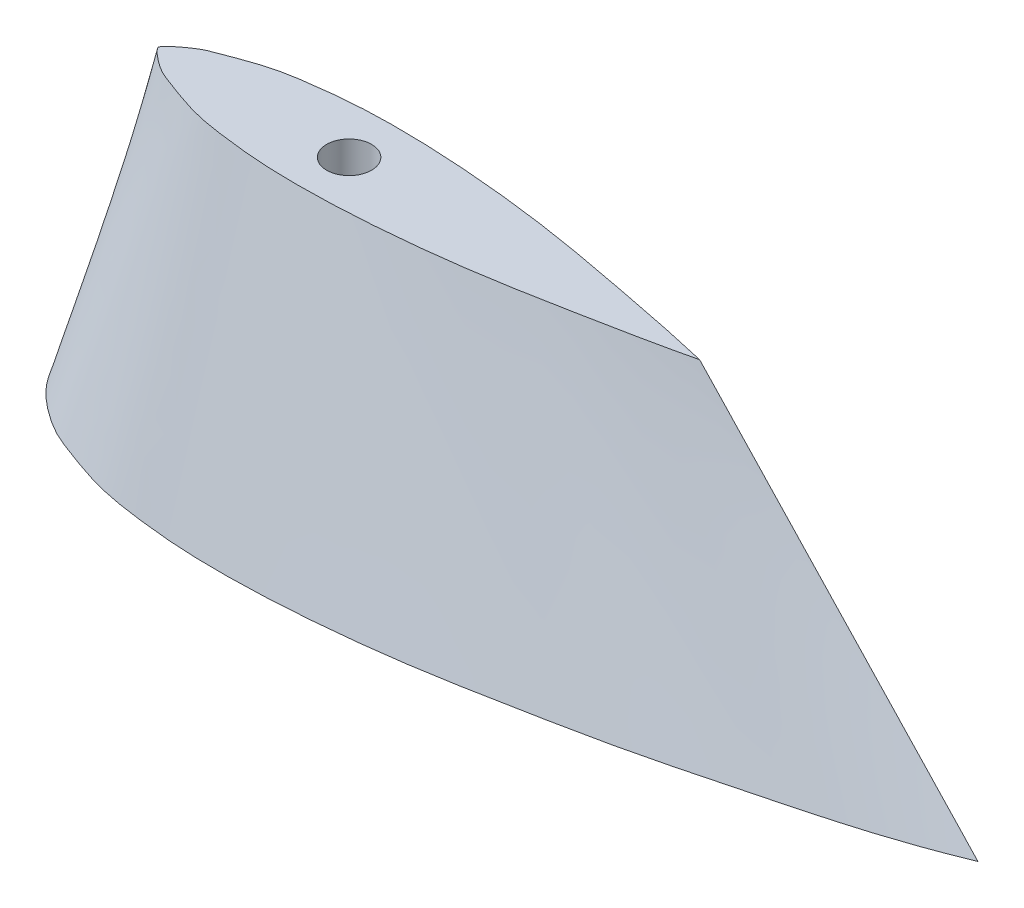
ISO-10303-21;
HEADER;
FILE_DESCRIPTION(('STEP AP214'),'2;1');
FILE_NAME('part.step','',(''),(''),'','','');
FILE_SCHEMA(('AUTOMOTIVE_DESIGN { 1 0 10303 214 1 1 1 1 }'));
ENDSEC;
DATA;
#1=APPLICATION_CONTEXT('core data for automotive mechanical design processes');
#2=APPLICATION_PROTOCOL_DEFINITION('international standard','automotive_design',2000,#1);
#3=PRODUCT_CONTEXT('',#1,'mechanical');
#4=PRODUCT('Part','Part','',(#3));
#5=PRODUCT_RELATED_PRODUCT_CATEGORY('part','',(#4));
#6=PRODUCT_DEFINITION_FORMATION('','',#4);
#7=PRODUCT_DEFINITION_CONTEXT('part definition',#1,'design');
#8=PRODUCT_DEFINITION('design','',#6,#7);
#9=PRODUCT_DEFINITION_SHAPE('','',#8);
#10=(LENGTH_UNIT() NAMED_UNIT(*) SI_UNIT(.MILLI.,.METRE.));
#11=(NAMED_UNIT(*) PLANE_ANGLE_UNIT() SI_UNIT($,.RADIAN.));
#12=(NAMED_UNIT(*) SI_UNIT($,.STERADIAN.) SOLID_ANGLE_UNIT());
#13=UNCERTAINTY_MEASURE_WITH_UNIT(LENGTH_MEASURE(1.E-05),#10,'distance_accuracy_value','');
#14=(GEOMETRIC_REPRESENTATION_CONTEXT(3) GLOBAL_UNCERTAINTY_ASSIGNED_CONTEXT((#13)) GLOBAL_UNIT_ASSIGNED_CONTEXT((#10,
#11,#12)) REPRESENTATION_CONTEXT('',''));
#15=CARTESIAN_POINT('',(0.,0.,0.));
#16=DIRECTION('',(0.,0.,1.));
#17=DIRECTION('',(1.,0.,0.));
#18=AXIS2_PLACEMENT_3D('',#15,#16,#17);
#19=CARTESIAN_POINT('',(19.0802860059302,0.,5.18409429456845));
#20=DIRECTION('',(0.,-1.,0.));
#21=DIRECTION('',(0.,0.,-1.));
#22=AXIS2_PLACEMENT_3D('',#19,#20,#21);
#23=PLANE('',#22);
#24=CARTESIAN_POINT('',(0.,0.,0.));
#25=CARTESIAN_POINT('',(-0.0267862569875493,0.,0.969360716181965));
#26=CARTESIAN_POINT('',(0.617375659509529,0.,2.24930193441446));
#27=CARTESIAN_POINT('',(1.97482933682201,0.,3.39277564434882));
#28=CARTESIAN_POINT('',(2.99392084160678,0.,4.05195265848345));
#29=CARTESIAN_POINT('',(4.35572051871566,0.,4.56510135506526));
#30=CARTESIAN_POINT('',(5.9908082561554,0.,5.164346360671));
#31=CARTESIAN_POINT('',(8.01785030280747,0.,5.47891926631261));
#32=CARTESIAN_POINT('',(10.008939200588,0.,5.68541086366569));
#33=CARTESIAN_POINT('',(12.6758373668734,0.,5.74502086480361));
#34=CARTESIAN_POINT('',(16.0113581950967,0.,5.57131916796599));
#35=CARTESIAN_POINT('',(20.0191877740499,0.,5.09406590814649));
#36=CARTESIAN_POINT('',(23.9996212201312,0.,4.33539965898221));
#37=CARTESIAN_POINT('',(28.002273255999,0.,3.54824991840482));
#38=CARTESIAN_POINT('',(31.9895849783426,0.,2.48087377414352));
#39=CARTESIAN_POINT('',(36.0342167931576,0.,1.46216580021811));
#40=CARTESIAN_POINT('',(38.6894828941162,0.,0.534654706419167));
#41=CARTESIAN_POINT('',(39.98934,0.,0.));
#42=B_SPLINE_CURVE_WITH_KNOTS('',3,(#24,#25,#26,#27,#28,#29,#30,#31,#32,#33,#34,#35,#36,#37,#38,
#39,#40,#41),.UNSPECIFIED.,.F.,.F.,(4,1,1,1,1,1,1,1,1,1,1,1,1,1,1,4),(0.,0.0635158889828134,
0.0951250781733294,0.122624180129919,0.14741856907962,0.196010901472146,0.243367076159032,
0.289416436062413,0.335172982570437,0.42859362926416,0.521350125542034,0.615481240432389,
0.710185536025907,0.804793670830186,0.902313956548564,1.),.UNSPECIFIED.);
#43=CARTESIAN_POINT('',(0.,0.,0.));
#44=VERTEX_POINT('',#43);
#45=CARTESIAN_POINT('',(39.98934,0.,0.));
#46=VERTEX_POINT('',#45);
#47=EDGE_CURVE('E73',#44,#46,#42,.T.);
#48=ORIENTED_EDGE('',*,*,#47,.F.);
#49=CARTESIAN_POINT('',(39.98934,0.,0.));
#50=CARTESIAN_POINT('',(38.6894828941162,0.,-0.534654706419167));
#51=CARTESIAN_POINT('',(36.0342167931576,0.,-1.46216580021811));
#52=CARTESIAN_POINT('',(31.9895849783426,0.,-2.48087377414352));
#53=CARTESIAN_POINT('',(28.002273255999,0.,-3.54824991840482));
#54=CARTESIAN_POINT('',(23.9996212201312,0.,-4.33539965898221));
#55=CARTESIAN_POINT('',(20.0191877740499,0.,-5.09406590814649));
#56=CARTESIAN_POINT('',(16.0113581950967,0.,-5.57131916796599));
#57=CARTESIAN_POINT('',(12.6758373668734,0.,-5.74502086480361));
#58=CARTESIAN_POINT('',(10.008939200588,0.,-5.68541086366568));
#59=CARTESIAN_POINT('',(8.01785030280747,0.,-5.4789192663126));
#60=CARTESIAN_POINT('',(5.9908082561554,0.,-5.164346360671));
#61=CARTESIAN_POINT('',(4.35572051871565,0.,-4.56510135506527));
#62=CARTESIAN_POINT('',(2.99392084160678,0.,-4.05195265848345));
#63=CARTESIAN_POINT('',(1.97482933682201,0.,-3.39277564434882));
#64=CARTESIAN_POINT('',(0.617375659509529,0.,-2.24930193441446));
#65=CARTESIAN_POINT('',(-0.0267862569875492,0.,-0.969360716181965));
#66=CARTESIAN_POINT('',(0.,0.,0.));
#67=B_SPLINE_CURVE_WITH_KNOTS('',3,(#49,#50,#51,#52,#53,#54,#55,#56,#57,#58,#59,#60,#61,#62,#63,
#64,#65,#66),.UNSPECIFIED.,.F.,.F.,(4,1,1,1,1,1,1,1,1,1,1,1,1,1,1,4),(0.,0.0976860434514363,
0.195206329169814,0.289814463974093,0.384518759567611,0.478649874457966,0.57140637073584,
0.664827017429563,0.710583563937587,0.756632923840968,0.803989098527854,0.85258143092038,
0.877375819870081,0.904874921826671,0.936484111017187,1.),.UNSPECIFIED.);
#68=EDGE_CURVE('E12',#46,#44,#67,.T.);
#69=ORIENTED_EDGE('',*,*,#68,.F.);
#70=EDGE_LOOP('',(#48,#69));
#71=FACE_BOUND('',#70,.T.);
#72=CARTESIAN_POINT('',(11.9968,0.,0.));
#73=DIRECTION('',(0.,1.,0.));
#74=DIRECTION('',(0.,0.,1.));
#75=AXIS2_PLACEMENT_3D('',#72,#73,#74);
#76=CIRCLE('',#75,2.);
#77=CARTESIAN_POINT('',(11.9968,0.,2.));
#78=VERTEX_POINT('',#77);
#79=EDGE_CURVE('E349',#78,#78,#76,.T.);
#80=ORIENTED_EDGE('',*,*,#79,.T.);
#81=EDGE_LOOP('',(#80));
#82=FACE_BOUND('',#81,.T.);
#83=DIRECTION('',(0.707106781186546,0.,0.707106781186549));
#84=VECTOR('',#83,1.);
#85=CARTESIAN_POINT('',(15.3578199523359,0.,3.3610199523359));
#86=LINE('',#85,#84);
#87=CARTESIAN_POINT('',(15.3578199523359,0.,3.3610199523359));
#88=VERTEX_POINT('',#87);
#89=CARTESIAN_POINT('',(16.772033514709,0.,4.77523351470901));
#90=VERTEX_POINT('',#89);
#91=EDGE_CURVE('E283',#88,#90,#86,.T.);
#92=ORIENTED_EDGE('',*,*,#91,.T.);
#93=CARTESIAN_POINT('',(11.9968,0.,0.));
#94=DIRECTION('',(0.,1.,0.));
#95=DIRECTION('',(0.,0.,1.));
#96=AXIS2_PLACEMENT_3D('',#93,#94,#95);
#97=CIRCLE('',#96,6.75320000000001);
#98=CARTESIAN_POINT('',(18.675550649635,0.,1.));
#99=VERTEX_POINT('',#98);
#100=EDGE_CURVE('E295',#90,#99,#97,.T.);
#101=ORIENTED_EDGE('',*,*,#100,.T.);
#102=DIRECTION('',(1.,0.,0.));
#103=VECTOR('',#102,1.);
#104=CARTESIAN_POINT('',(0.,0.,1.));
#105=LINE('',#104,#103);
#106=CARTESIAN_POINT('',(18.75,0.,1.));
#107=VERTEX_POINT('',#106);
#108=EDGE_CURVE('E320',#99,#107,#105,.T.);
#109=ORIENTED_EDGE('',*,*,#108,.T.);
#110=DIRECTION('',(0.,0.,-1.));
#111=VECTOR('',#110,1.);
#112=CARTESIAN_POINT('',(18.75,0.,0.));
#113=LINE('',#112,#111);
#114=CARTESIAN_POINT('',(18.75,0.,-0.999999999999998));
#115=VERTEX_POINT('',#114);
#116=EDGE_CURVE('E331',#107,#115,#113,.T.);
#117=ORIENTED_EDGE('',*,*,#116,.T.);
#118=DIRECTION('',(1.,0.,0.));
#119=VECTOR('',#118,1.);
#120=CARTESIAN_POINT('',(0.,0.,-0.999999999999998));
#121=LINE('',#120,#119);
#122=CARTESIAN_POINT('',(18.675550649635,0.,-0.999999999999998));
#123=VERTEX_POINT('',#122);
#124=EDGE_CURVE('E314',#123,#115,#121,.T.);
#125=ORIENTED_EDGE('',*,*,#124,.F.);
#126=CARTESIAN_POINT('',(16.772033514709,0.,-4.775233514709));
#127=VERTEX_POINT('',#126);
#128=EDGE_CURVE('E81',#123,#127,#97,.T.);
#129=ORIENTED_EDGE('',*,*,#128,.T.);
#130=DIRECTION('',(0.707106781186546,0.,-0.707106781186549));
#131=VECTOR('',#130,1.);
#132=CARTESIAN_POINT('',(15.3578199523359,0.,-3.3610199523359));
#133=LINE('',#132,#131);
#134=CARTESIAN_POINT('',(15.3578199523359,0.,-3.3610199523359));
#135=VERTEX_POINT('',#134);
#136=EDGE_CURVE('E253',#135,#127,#133,.T.);
#137=ORIENTED_EDGE('',*,*,#136,.F.);
#138=CARTESIAN_POINT('',(11.9968,0.,0.));
#139=DIRECTION('',(0.,1.,0.));
#140=DIRECTION('',(0.,0.,1.));
#141=AXIS2_PLACEMENT_3D('',#138,#139,#140);
#142=CIRCLE('',#141,4.7532);
#143=EDGE_CURVE('E266',#88,#135,#142,.T.);
#144=ORIENTED_EDGE('',*,*,#143,.F.);
#145=EDGE_LOOP('',(#92,#101,#109,#117,#125,#129,#137,#144));
#146=FACE_BOUND('',#145,.T.);
#147=ADVANCED_FACE('F61',(#71,#82,#146),#23,.T.);
#148=CARTESIAN_POINT('',(0.,1.5,1.));
#149=DIRECTION('',(0.,0.,-1.));
#150=DIRECTION('',(-1.,0.,0.));
#151=AXIS2_PLACEMENT_3D('',#148,#149,#150);
#152=PLANE('',#151);
#153=ORIENTED_EDGE('',*,*,#108,.F.);
#154=DIRECTION('',(0.,1.,0.));
#155=VECTOR('',#154,1.);
#156=CARTESIAN_POINT('',(18.675550649635,4.,1.));
#157=LINE('',#156,#155);
#158=CARTESIAN_POINT('',(18.675550649635,1.5,1.));
#159=VERTEX_POINT('',#158);
#160=EDGE_CURVE('E310',#99,#159,#157,.T.);
#161=ORIENTED_EDGE('',*,*,#160,.T.);
#162=DIRECTION('',(1.,0.,0.));
#163=VECTOR('',#162,1.);
#164=CARTESIAN_POINT('',(0.,1.5,1.));
#165=LINE('',#164,#163);
#166=CARTESIAN_POINT('',(18.75,1.5,1.));
#167=VERTEX_POINT('',#166);
#168=EDGE_CURVE('E323',#159,#167,#165,.T.);
#169=ORIENTED_EDGE('',*,*,#168,.T.);
#170=DIRECTION('',(0.,-1.,0.));
#171=VECTOR('',#170,1.);
#172=CARTESIAN_POINT('',(18.75,1.5,1.));
#173=LINE('',#172,#171);
#174=EDGE_CURVE('E338',#167,#107,#173,.T.);
#175=ORIENTED_EDGE('',*,*,#174,.T.);
#176=EDGE_LOOP('',(#153,#161,#169,#175));
#177=FACE_BOUND('',#176,.T.);
#178=ADVANCED_FACE('F194',(#177),#152,.T.);
#179=CARTESIAN_POINT('',(0.,1.5,-0.999999999999998));
#180=DIRECTION('',(0.,0.,-1.));
#181=DIRECTION('',(-1.,0.,0.));
#182=AXIS2_PLACEMENT_3D('',#179,#180,#181);
#183=PLANE('',#182);
#184=DIRECTION('',(0.,1.,0.));
#185=VECTOR('',#184,1.);
#186=CARTESIAN_POINT('',(18.675550649635,4.,-0.999999999999998));
#187=LINE('',#186,#185);
#188=CARTESIAN_POINT('',(18.675550649635,1.5,-0.999999999999998));
#189=VERTEX_POINT('',#188);
#190=EDGE_CURVE('E307',#123,#189,#187,.T.);
#191=ORIENTED_EDGE('',*,*,#190,.F.);
#192=ORIENTED_EDGE('',*,*,#124,.T.);
#193=DIRECTION('',(0.,-1.,0.));
#194=VECTOR('',#193,1.);
#195=CARTESIAN_POINT('',(18.75,1.5,-0.999999999999998));
#196=LINE('',#195,#194);
#197=CARTESIAN_POINT('',(18.75,1.5,-0.999999999999998));
#198=VERTEX_POINT('',#197);
#199=EDGE_CURVE('E327',#198,#115,#196,.T.);
#200=ORIENTED_EDGE('',*,*,#199,.F.);
#201=DIRECTION('',(1.,0.,0.));
#202=VECTOR('',#201,1.);
#203=CARTESIAN_POINT('',(0.,1.5,-0.999999999999998));
#204=LINE('',#203,#202);
#205=EDGE_CURVE('E315',#189,#198,#204,.T.);
#206=ORIENTED_EDGE('',*,*,#205,.F.);
#207=EDGE_LOOP('',(#191,#192,#200,#206));
#208=FACE_BOUND('',#207,.T.);
#209=ADVANCED_FACE('F212',(#208),#183,.F.);
#210=CARTESIAN_POINT('',(15.4096175103177,13.15,2.06445008176209));
#211=DIRECTION('',(0.,-1.,0.));
#212=DIRECTION('',(0.,0.,-1.));
#213=AXIS2_PLACEMENT_3D('',#210,#211,#212);
#214=PLANE('',#213);
#215=CARTESIAN_POINT('',(11.9968,13.15,0.));
#216=DIRECTION('',(0.,1.,0.));
#217=DIRECTION('',(0.,0.,1.));
#218=AXIS2_PLACEMENT_3D('',#215,#216,#217);
#219=CIRCLE('',#218,1.);
#220=CARTESIAN_POINT('',(11.9968,13.15,1.));
#221=VERTEX_POINT('',#220);
#222=EDGE_CURVE('E342',#221,#221,#219,.T.);
#223=ORIENTED_EDGE('',*,*,#222,.F.);
#224=EDGE_LOOP('',(#223));
#225=FACE_BOUND('',#224,.T.);
#226=CARTESIAN_POINT('',(3.49502453361236,13.15,0.));
#227=CARTESIAN_POINT('',(3.52783648685748,13.15,0.0578802805129642));
#228=CARTESIAN_POINT('',(3.57019641452592,13.15,0.109749182285396));
#229=CARTESIAN_POINT('',(3.65886996238812,13.15,0.208341359987878));
#230=CARTESIAN_POINT('',(3.70652893983133,13.15,0.254882194309004));
#231=CARTESIAN_POINT('',(3.85318123666836,13.15,0.388672417564009));
#232=CARTESIAN_POINT('',(3.95646294657575,13.15,0.470726547777688));
#233=CARTESIAN_POINT('',(4.16779494911165,13.15,0.62866005238863));
#234=CARTESIAN_POINT('',(4.2755874455875,13.15,0.704873242593614));
#235=CARTESIAN_POINT('',(4.49978996324191,13.15,0.846140938364016));
#236=CARTESIAN_POINT('',(4.61539075255237,13.15,0.907467588020139));
#237=CARTESIAN_POINT('',(4.85348743878743,13.15,1.01062304020525));
#238=CARTESIAN_POINT('',(4.97441630687829,13.15,1.05698878100666));
#239=CARTESIAN_POINT('',(5.21668869592504,13.15,1.14857102786693));
#240=CARTESIAN_POINT('',(5.33806631315454,13.15,1.19369303410308));
#241=CARTESIAN_POINT('',(5.70232186173396,13.15,1.32871899118004));
#242=CARTESIAN_POINT('',(5.94564329842536,13.15,1.41739374094715));
#243=CARTESIAN_POINT('',(6.4365621974042,13.15,1.58289198467385));
#244=CARTESIAN_POINT('',(6.68409437060288,13.15,1.65989643117341));
#245=CARTESIAN_POINT('',(7.18910829636706,13.15,1.7863294812304));
#246=CARTESIAN_POINT('',(7.44564437280883,13.15,1.83625827459987));
#247=CARTESIAN_POINT('',(7.95666540004131,13.15,1.92186763256478));
#248=CARTESIAN_POINT('',(8.21245069534998,13.15,1.95770180616351));
#249=CARTESIAN_POINT('',(8.72423300626651,13.15,2.02399935346357));
#250=CARTESIAN_POINT('',(8.98023200814217,13.15,2.05441234065524));
#251=CARTESIAN_POINT('',(9.74864997427261,13.15,2.13497261607166));
#252=CARTESIAN_POINT('',(10.2615367544399,13.15,2.17325261682288));
#253=CARTESIAN_POINT('',(11.288759592588,13.15,2.21304816464643));
#254=CARTESIAN_POINT('',(11.8029975192729,13.15,2.21705305051363));
#255=CARTESIAN_POINT('',(13.346857368183,13.15,2.19999488650282));
#256=CARTESIAN_POINT('',(14.3787372530508,13.15,2.1469215826625));
#257=CARTESIAN_POINT('',(16.4404977675845,13.15,1.98197858086167));
#258=CARTESIAN_POINT('',(17.4666951934531,13.15,1.87149655962416));
#259=CARTESIAN_POINT('',(19.5095691820538,13.15,1.59358314019471));
#260=CARTESIAN_POINT('',(20.5256554222723,13.15,1.42262070717237));
#261=CARTESIAN_POINT('',(22.0459077167077,13.15,1.14298625195176));
#262=CARTESIAN_POINT('',(22.5520738663946,13.15,1.04627787099308));
#263=CARTESIAN_POINT('',(23.5640788122461,13.15,0.850903032495258));
#264=CARTESIAN_POINT('',(24.0700108987621,13.15,0.752794594466486));
#265=CARTESIAN_POINT('',(25.5866270682723,13.15,0.451410530407656));
#266=CARTESIAN_POINT('',(26.5959582445756,13.15,0.240042445529623));
#267=CARTESIAN_POINT('',(27.600495607884,13.15,0.));
#268=B_SPLINE_CURVE_WITH_KNOTS('',3,(#226,#227,#228,#229,#230,#231,#232,#233,#234,#235,#236,
#237,#238,#239,#240,#241,#242,#243,#244,#245,#246,#247,#248,#249,#250,#251,#252,#253,#254,#255,
#256,#257,#258,#259,#260,#261,#262,#263,#264,#265,#266,#267),.UNSPECIFIED.,.F.,.F.,(4,2,2,2,2,2,
2,2,2,2,2,2,2,2,2,2,2,2,2,2,4),(0.,0.00781250000000006,0.0156250000000001,0.0312500000000002,
0.0468750000000003,0.0625000000000004,0.0781250000000005,0.0937500000000006,0.125000000000001,
0.156250000000001,0.187500000000001,0.218750000000001,0.250000000000001,0.312500000000001,
0.375000000000001,0.500000000000001,0.625,0.75,0.8125,0.875,1.),.UNSPECIFIED.);
#269=CARTESIAN_POINT('',(3.49502453361236,13.15,0.));
#270=VERTEX_POINT('',#269);
#271=CARTESIAN_POINT('',(27.6004956078839,13.15,0.));
#272=VERTEX_POINT('',#271);
#273=EDGE_CURVE('E105',#270,#272,#268,.T.);
#274=ORIENTED_EDGE('',*,*,#273,.T.);
#275=CARTESIAN_POINT('',(27.6004956078839,13.15,0.));
#276=CARTESIAN_POINT('',(26.5970238757128,13.15,-0.239787804225526));
#277=CARTESIAN_POINT('',(25.5903034316414,13.15,-0.450633428897801));
#278=CARTESIAN_POINT('',(24.0784535103549,13.15,-0.751139895423985));
#279=CARTESIAN_POINT('',(23.5742360869212,13.15,-0.84892605743988));
#280=CARTESIAN_POINT('',(22.5657073018342,13.15,-1.04366150307037));
#281=CARTESIAN_POINT('',(22.0613346726119,13.15,-1.14006496513042));
#282=CARTESIAN_POINT('',(20.5470464564753,13.15,-1.41884910923326));
#283=CARTESIAN_POINT('',(19.5358008319255,13.15,-1.58938072948291));
#284=CARTESIAN_POINT('',(17.5061590894782,13.15,-1.86674153384));
#285=CARTESIAN_POINT('',(16.4881540513167,13.15,-1.97705477571856));
#286=CARTESIAN_POINT('',(14.4459605242078,13.15,-2.14259402847444));
#287=CARTESIAN_POINT('',(13.4216881908912,13.15,-2.19707308521732));
#288=CARTESIAN_POINT('',(11.8783612945319,13.15,-2.21715694354417));
#289=CARTESIAN_POINT('',(11.3628515046538,13.15,-2.21434148028481));
#290=CARTESIAN_POINT('',(10.328296524146,13.15,-2.17721431572193));
#291=CARTESIAN_POINT('',(9.80895522905007,13.15,-2.14026467393841));
#292=CARTESIAN_POINT('',(9.02712939573157,13.15,-2.0597717744037));
#293=CARTESIAN_POINT('',(8.76649027299236,13.15,-2.02917017133057));
#294=CARTESIAN_POINT('',(8.246673773856,13.15,-1.96239676326558));
#295=CARTESIAN_POINT('',(7.98718809029197,13.15,-1.92643553719816));
#296=CARTESIAN_POINT('',(7.47045048117546,13.15,-1.84090371004215));
#297=CARTESIAN_POINT('',(7.21317263343112,13.15,-1.79149104227879));
#298=CARTESIAN_POINT('',(6.7030849748272,13.15,-1.66544378331271));
#299=CARTESIAN_POINT('',(6.45125789812067,13.15,-1.58763006959447));
#300=CARTESIAN_POINT('',(5.95313958794608,13.15,-1.42012760680646));
#301=CARTESIAN_POINT('',(5.70620412461664,13.15,-1.33015687682568));
#302=CARTESIAN_POINT('',(5.33651225541853,13.15,-1.19311757473801));
#303=CARTESIAN_POINT('',(5.21327113848951,13.15,-1.14731275914894));
#304=CARTESIAN_POINT('',(4.96752208583141,13.15,-1.05434762506602));
#305=CARTESIAN_POINT('',(4.84496633941889,13.15,-1.00728373387173));
#306=CARTESIAN_POINT('',(4.48580634152626,13.15,-0.85057833244267));
#307=CARTESIAN_POINT('',(4.26912100960824,13.15,-0.704612861884415));
#308=CARTESIAN_POINT('',(3.95354488041104,13.15,-0.468428314395131));
#309=CARTESIAN_POINT('',(3.84988299049597,13.15,-0.385871663651552));
#310=CARTESIAN_POINT('',(3.70460514640842,13.15,-0.253019134715244));
#311=CARTESIAN_POINT('',(3.65777763929067,13.15,-0.207183213558207));
#312=CARTESIAN_POINT('',(3.57015940668381,13.15,-0.109650945184433));
#313=CARTESIAN_POINT('',(3.52840755560896,13.15,-0.0588876457033497));
#314=CARTESIAN_POINT('',(3.49502453361236,13.15,0.));
#315=B_SPLINE_CURVE_WITH_KNOTS('',3,(#275,#276,#277,#278,#279,#280,#281,#282,#283,#284,#285,
#286,#287,#288,#289,#290,#291,#292,#293,#294,#295,#296,#297,#298,#299,#300,#301,#302,#303,#304,
#305,#306,#307,#308,#309,#310,#311,#312,#313,#314),.UNSPECIFIED.,.F.,.F.,(4,2,2,2,2,2,2,2,2,2,2,
2,2,2,2,2,2,2,2,4),(0.,0.125,0.1875,0.25,0.375,0.5,0.625,0.6875,0.75,0.781249999999999,
0.812499999999999,0.84375,0.875,0.90625,0.921875,0.9375,0.96875,0.984375,0.9921875,1.),.UNSPECIFIED.);
#316=EDGE_CURVE('E102',#272,#270,#315,.T.);
#317=ORIENTED_EDGE('',*,*,#316,.T.);
#318=EDGE_LOOP('',(#274,#317));
#319=FACE_BOUND('',#318,.T.);
#320=ADVANCED_FACE('F63',(#225,#319),#214,.F.);
#321=CARTESIAN_POINT('',(39.98934,0.,0.));
#322=CARTESIAN_POINT('',(27.6004956078839,13.15,0.));
#323=CARTESIAN_POINT('',(38.6894828941162,0.,-0.534654706419167));
#324=CARTESIAN_POINT('',(26.8162941420347,13.15,-0.187391374901594));
#325=CARTESIAN_POINT('',(36.989188318467,0.,-1.12858466359802));
#326=CARTESIAN_POINT('',(25.8102835793687,13.15,-0.404561203051774));
#327=CARTESIAN_POINT('',(35.2605920883906,0.,-1.62354844781566));
#328=CARTESIAN_POINT('',(24.8026413670929,13.15,-0.607194963545877));
#329=CARTESIAN_POINT('',(34.0155724838337,0.,-1.96873712394325));
#330=CARTESIAN_POINT('',(24.0784535103549,13.15,-0.751139895423985));
#331=CARTESIAN_POINT('',(33.1444027192992,0.,-2.19231051911635));
#332=CARTESIAN_POINT('',(23.5742360869212,13.15,-0.84892605743988));
#333=CARTESIAN_POINT('',(32.1663403636148,0.,-2.44559201466678));
#334=CARTESIAN_POINT('',(23.0077952560168,13.15,-0.958299343815595));
#335=CARTESIAN_POINT('',(31.2956943434231,0.,-2.67130662738813));
#336=CARTESIAN_POINT('',(22.5035175177537,13.15,-1.05554817205828));
#337=CARTESIAN_POINT('',(30.4261616774186,0.,-2.90121388434487));
#338=CARTESIAN_POINT('',(21.9990967875371,13.15,-1.15152311116659));
#339=CARTESIAN_POINT('',(29.107051240625,0.,-3.2365994141171));
#340=CARTESIAN_POINT('',(21.2350222078849,13.15,-1.292191099895));
#341=CARTESIAN_POINT('',(27.3614326474527,0.,-3.66759668925395));
#342=CARTESIAN_POINT('',(20.2249488365745,13.15,-1.47316610964024));
#343=CARTESIAN_POINT('',(25.5976282304248,0.,-4.02066769455246));
#344=CARTESIAN_POINT('',(19.2125644397856,13.15,-1.63355261649451));
#345=CARTESIAN_POINT('',(24.2598294094227,0.,-4.28093710864366));
#346=CARTESIAN_POINT('',(18.4437012736829,13.15,-1.73862165490207));
#347=CARTESIAN_POINT('',(22.7954837837284,0.,-4.56490693368703));
#348=CARTESIAN_POINT('',(17.6020117668273,13.15,-1.85182410142012));
#349=CARTESIAN_POINT('',(21.0285502575417,0.,-4.9016825258413));
#350=CARTESIAN_POINT('',(16.5843139501096,13.15,-1.9648743228962));
#351=CARTESIAN_POINT('',(19.3845754739158,0.,-5.14205385611547));
#352=CARTESIAN_POINT('',(15.6414616405019,13.15,-2.04568726678261));
#353=CARTESIAN_POINT('',(18.0625773971814,0.,-5.3247002656275));
#354=CARTESIAN_POINT('',(14.883754775318,13.15,-2.10710663111098));
#355=CARTESIAN_POINT('',(16.2741395980495,0.,-5.52385497568521));
#356=CARTESIAN_POINT('',(13.8608439644697,13.15,-2.1737152422594));
#357=CARTESIAN_POINT('',(14.4787007989329,0.,-5.64297223349277));
#358=CARTESIAN_POINT('',(12.8339368707418,13.15,-2.20472170086261));
#359=CARTESIAN_POINT('',(13.135551788291,0.,-5.69896502748789));
#360=CARTESIAN_POINT('',(12.064984354914,13.15,-2.21472835170528));
#361=CARTESIAN_POINT('',(12.236315672847,0.,-5.72000310773631));
#362=CARTESIAN_POINT('',(11.5498618163465,13.15,-2.21536283947532));
#363=CARTESIAN_POINT('',(11.3366114512848,0.,-5.71098871604679));
#364=CARTESIAN_POINT('',(11.0332255907296,13.15,-2.20251216644356));
#365=CARTESIAN_POINT('',(10.6783768412891,0.,-5.69385612673943));
#366=CARTESIAN_POINT('',(10.6545242860839,13.15,-2.1889216797873));
#367=CARTESIAN_POINT('',(9.77989411462971,0.,-5.65580632265626));
#368=CARTESIAN_POINT('',(10.1364845562936,13.15,-2.16356744502464));
#369=CARTESIAN_POINT('',(8.88525512527583,0.,-5.56831462826781));
#370=CARTESIAN_POINT('',(9.61645041186111,13.15,-2.12044533534715));
#371=CARTESIAN_POINT('',(8.22689277206115,0.,-5.48837488222701));
#372=CARTESIAN_POINT('',(9.23242290060516,13.15,-2.08090777267685));
#373=CARTESIAN_POINT('',(7.78020633472554,0.,-5.43235880336383));
#374=CARTESIAN_POINT('',(8.97180781329617,13.15,-2.05327647512064));
#375=CARTESIAN_POINT('',(7.33386009145752,0.,-5.36869467976266));
#376=CARTESIAN_POINT('',(8.71132382099155,13.15,-2.02208372444582));
#377=CARTESIAN_POINT('',(6.66229427758368,0.,-5.25048047624944));
#378=CARTESIAN_POINT('',(8.31745948597993,13.15,-1.97148959361759));
#379=CARTESIAN_POINT('',(6.22207463450586,0.,-5.1592215035746));
#380=CARTESIAN_POINT('',(8.05785871705184,13.15,-1.93622953565823));
#381=CARTESIAN_POINT('',(5.78931812589357,0.,-5.03999700866379));
#382=CARTESIAN_POINT('',(7.799185731784,13.15,-1.89531687087867));
#383=CARTESIAN_POINT('',(5.24086917546428,0.,-4.88020878431981));
#384=CARTESIAN_POINT('',(7.47045048117546,13.15,-1.84090371004215));
#385=CARTESIAN_POINT('',(4.81607412659508,0.,-4.73126844598601));
#386=CARTESIAN_POINT('',(7.21317263343112,13.15,-1.79149104227879));
#387=CARTESIAN_POINT('',(4.27357636186127,0.,-4.53199370376904));
#388=CARTESIAN_POINT('',(6.88605194140437,13.15,-1.71065657023155));
#389=CARTESIAN_POINT('',(3.85112813726852,0.,-4.37481036344817));
#390=CARTESIAN_POINT('',(6.63191718500911,13.15,-1.64345317731716));
#391=CARTESIAN_POINT('',(3.4292583896778,0.,-4.21598430958224));
#392=CARTESIAN_POINT('',(6.38087233897693,13.15,-1.56396148672877));
#393=CARTESIAN_POINT('',(3.10756690228043,0.,-4.06325626479817));
#394=CARTESIAN_POINT('',(6.18326371296995,13.15,-1.4975115473304));
#395=CARTESIAN_POINT('',(2.72162234920927,0.,-3.87582234405221));
#396=CARTESIAN_POINT('',(5.94531813554933,13.15,-1.41699354092471));
#397=CARTESIAN_POINT('',(2.34205629139348,0.,-3.6303083548931));
#398=CARTESIAN_POINT('',(5.69833079547927,13.15,-1.32717473850771));
#399=CARTESIAN_POINT('',(2.00652526169337,0.,-3.38274567133049));
#400=CARTESIAN_POINT('',(5.47058778984865,13.15,-1.2428173901686));
#401=CARTESIAN_POINT('',(1.80942967727917,0.,-3.23638998264542));
#402=CARTESIAN_POINT('',(5.33651225541853,13.15,-1.19311757473801));
#403=CARTESIAN_POINT('',(1.63300767383244,0.,-3.09560942090144));
#404=CARTESIAN_POINT('',(5.21327113848951,13.15,-1.14731275914894));
#405=CARTESIAN_POINT('',(1.30708933738781,0.,-2.80674496728495));
#406=CARTESIAN_POINT('',(4.97551100599563,13.15,-1.05736977724204));
#407=CARTESIAN_POINT('',(1.14612259353375,0.,-2.64950796042556));
#408=CARTESIAN_POINT('',(4.85293453350279,13.15,-1.01034368193909));
#409=CARTESIAN_POINT('',(0.996187523446304,0.,-2.4816703862658));
#410=CARTESIAN_POINT('',(4.73303016273311,13.15,-0.958444766267035));
#411=CARTESIAN_POINT('',(0.68808588029631,0.,-2.13366757121641));
#412=CARTESIAN_POINT('',(4.48580634152626,13.15,-0.85057833244267));
#413=CARTESIAN_POINT('',(0.434874680722648,0.,-1.75445331471169));
#414=CARTESIAN_POINT('',(4.26912100960824,13.15,-0.704612861884415));
#415=CARTESIAN_POINT('',(0.171900382316454,0.,-1.13317607280338));
#416=CARTESIAN_POINT('',(3.95354488041104,13.15,-0.468428314395131));
#417=CARTESIAN_POINT('',(0.103716033006773,0.,-0.917341015975408));
#418=CARTESIAN_POINT('',(3.84988299049597,13.15,-0.385871663651552));
#419=CARTESIAN_POINT('',(0.0367823429905639,0.,-0.581824037323065));
#420=CARTESIAN_POINT('',(3.70460514640842,13.15,-0.253019134715244));
#421=CARTESIAN_POINT('',(0.0203615853098798,0.,-0.468024312203887));
#422=CARTESIAN_POINT('',(3.65777763929067,13.15,-0.207183213558207));
#423=CARTESIAN_POINT('',(0.000323049382905277,0.,-0.236728325974971));
#424=CARTESIAN_POINT('',(3.57015940668381,13.15,-0.109650945184433));
#425=CARTESIAN_POINT('',(-0.00329472886338498,0.,-0.119232064865233));
#426=CARTESIAN_POINT('',(3.52840755560896,13.15,-0.0588876457033497));
#427=CARTESIAN_POINT('',(0.,0.,0.));
#428=CARTESIAN_POINT('',(3.49502453361236,13.15,0.));
#429=B_SPLINE_SURFACE_WITH_KNOTS('',3,1,((#321,#322),(#323,#324),(#325,#326),(#327,#328),(#329,
#330),(#331,#332),(#333,#334),(#335,#336),(#337,#338),(#339,#340),(#341,#342),(#343,#344),(#345,
#346),(#347,#348),(#349,#350),(#351,#352),(#353,#354),(#355,#356),(#357,#358),(#359,#360),(#361,
#362),(#363,#364),(#365,#366),(#367,#368),(#369,#370),(#371,#372),(#373,#374),(#375,#376),(#377,
#378),(#379,#380),(#381,#382),(#383,#384),(#385,#386),(#387,#388),(#389,#390),(#391,#392),(#393,
#394),(#395,#396),(#397,#398),(#399,#400),(#401,#402),(#403,#404),(#405,#406),(#407,#408),(#409,
#410),(#411,#412),(#413,#414),(#415,#416),(#417,#418),(#419,#420),(#421,#422),(#423,#424),(#425,
#426),(#427,#428)),.UNSPECIFIED.,.F.,.F.,.F.,(4,1,2,2,1,2,1,2,1,1,2,1,2,1,2,1,2,1,2,1,2,2,1,2,1,
1,2,2,1,2,2,2,2,4),(2,2),(0.,0.0976860434514363,0.125,0.1875,0.195206329169814,0.25,
0.289814463974093,0.375,0.384518759567611,0.478649874457966,0.5,0.57140637073584,0.625,
0.664827017429563,0.6875,0.710583563937587,0.75,0.756632923840968,0.781249999999999,
0.803989098527854,0.812499999999999,0.84375,0.85258143092038,0.875,0.877375819870081,
0.904874921826671,0.90625,0.921875,0.936484111017187,0.9375,0.96875,0.984375,0.9921875,1.),(0.,
1.),.UNSPECIFIED.);
#430=DIRECTION('',(0.256863739421437,0.966447628881377,0.));
#431=VECTOR('',#430,1.);
#432=CARTESIAN_POINT('',(1.74751226680618,6.575,0.));
#433=LINE('',#432,#431);
#434=EDGE_CURVE('E118',#44,#270,#433,.T.);
#435=DIRECTION('',(0.685727796776657,-0.72785808282098,0.));
#436=VECTOR('',#435,1.);
#437=CARTESIAN_POINT('',(33.794917803942,6.575,0.));
#438=LINE('',#437,#436);
#439=EDGE_CURVE('E111',#272,#46,#438,.T.);
#440=ORIENTED_EDGE('',*,*,#68,.T.);
#441=ORIENTED_EDGE('',*,*,#434,.T.);
#442=ORIENTED_EDGE('',*,*,#316,.F.);
#443=ORIENTED_EDGE('',*,*,#439,.T.);
#444=EDGE_LOOP('',(#440,#441,#442,#443));
#445=FACE_BOUND('',#444,.T.);
#446=ADVANCED_FACE('F124',(#445),#429,.T.);
#447=CARTESIAN_POINT('',(0.,0.,0.));
#448=CARTESIAN_POINT('',(3.49502453361236,13.15,0.));
#449=CARTESIAN_POINT('',(-0.00329472886338497,0.,0.119232064865232));
#450=CARTESIAN_POINT('',(3.52783648685748,13.15,0.0578802805129642));
#451=CARTESIAN_POINT('',(0.000323049382905216,0.,0.236728325974969));
#452=CARTESIAN_POINT('',(3.57019641452592,13.15,0.109749182285396));
#453=CARTESIAN_POINT('',(0.0203615853098796,0.,0.468024312203885));
#454=CARTESIAN_POINT('',(3.65886996238812,13.15,0.208341359987878));
#455=CARTESIAN_POINT('',(0.0367823429905637,0.,0.581824037323064));
#456=CARTESIAN_POINT('',(3.70652893983133,13.15,0.254882194309004));
#457=CARTESIAN_POINT('',(0.103716033006773,0.,0.917341015975408));
#458=CARTESIAN_POINT('',(3.85318123666836,13.15,0.388672417564009));
#459=CARTESIAN_POINT('',(0.171900382316454,0.,1.13317607280338));
#460=CARTESIAN_POINT('',(3.95646294657575,13.15,0.470726547777688));
#461=CARTESIAN_POINT('',(0.347216581253916,0.,1.54736090074225));
#462=CARTESIAN_POINT('',(4.16779494911165,13.15,0.62866005238863));
#463=CARTESIAN_POINT('',(0.454348430881697,0.,1.74571067185315));
#464=CARTESIAN_POINT('',(4.2755874455875,13.15,0.704873242593614));
#465=CARTESIAN_POINT('',(0.699383352175709,0.,2.12312550052131));
#466=CARTESIAN_POINT('',(4.49978996324191,13.15,0.846140938364016));
#467=CARTESIAN_POINT('',(0.83728642384194,0.,2.30219055807858));
#468=CARTESIAN_POINT('',(4.61539075255237,13.15,0.907467588020139));
#469=CARTESIAN_POINT('',(0.996187523446304,0.,2.4816703862658));
#470=CARTESIAN_POINT('',(4.7421792492824,13.15,0.962398737709236));
#471=CARTESIAN_POINT('',(1.14612259353375,0.,2.64950796042556));
#472=CARTESIAN_POINT('',(4.86134985829447,13.15,1.0136375967019));
#473=CARTESIAN_POINT('',(1.30708933738781,0.,2.80674496728495));
#474=CARTESIAN_POINT('',(4.9822922061062,13.15,1.05996597766607));
#475=CARTESIAN_POINT('',(1.63300767383245,0.,3.09560942090145));
#476=CARTESIAN_POINT('',(5.21668869592504,13.15,1.14857102786693));
#477=CARTESIAN_POINT('',(1.80942967727918,0.,3.23638998264543));
#478=CARTESIAN_POINT('',(5.33806631315454,13.15,1.19369303410308));
#479=CARTESIAN_POINT('',(2.00652526169338,0.,3.38274567133049));
#480=CARTESIAN_POINT('',(5.47017026624081,13.15,1.24266267305213));
#481=CARTESIAN_POINT('',(2.34205629139349,0.,3.6303083548931));
#482=CARTESIAN_POINT('',(5.69456500763345,13.15,1.3257817164643));
#483=CARTESIAN_POINT('',(2.72162234920928,0.,3.87582234405221));
#484=CARTESIAN_POINT('',(5.93793816291018,13.15,1.41431312513791));
#485=CARTESIAN_POINT('',(3.10756690228043,0.,4.06325626479817));
#486=CARTESIAN_POINT('',(6.1724413899181,13.15,1.49385175855595));
#487=CARTESIAN_POINT('',(3.42925838967781,0.,4.21598430958225));
#488=CARTESIAN_POINT('',(6.36719393590274,13.15,1.55950660376318));
#489=CARTESIAN_POINT('',(3.85112813726853,0.,4.37481036344817));
#490=CARTESIAN_POINT('',(6.61414034538125,13.15,1.63813452877907));
#491=CARTESIAN_POINT('',(4.27357636186128,0.,4.53199370376904));
#492=CARTESIAN_POINT('',(6.8652414038975,13.15,1.70524760023981));
#493=CARTESIAN_POINT('',(4.81607412659509,0.,4.73126844598601));
#494=CARTESIAN_POINT('',(7.18910829636706,13.15,1.7863294812304));
#495=CARTESIAN_POINT('',(5.24086917546429,0.,4.88020878431981));
#496=CARTESIAN_POINT('',(7.44564437280883,13.15,1.83625827459987));
#497=CARTESIAN_POINT('',(5.78931812589357,0.,5.03999700866379));
#498=CARTESIAN_POINT('',(7.7707428802326,13.15,1.89072075855405));
#499=CARTESIAN_POINT('',(6.22207463450587,0.,5.1592215035746));
#500=CARTESIAN_POINT('',(8.02632823032598,13.15,1.93162702843149));
#501=CARTESIAN_POINT('',(6.66229427758369,0.,5.25048047624944));
#502=CARTESIAN_POINT('',(8.28214235652434,13.15,1.96672983645016));
#503=CARTESIAN_POINT('',(7.33386009145753,0.,5.36869467976266));
#504=CARTESIAN_POINT('',(8.66991919680308,13.15,2.01696340815022));
#505=CARTESIAN_POINT('',(7.78020633472556,0.,5.43235880336383));
#506=CARTESIAN_POINT('',(8.9258953078924,13.15,2.04795707576504));
#507=CARTESIAN_POINT('',(8.22689277206116,0.,5.48837488222701));
#508=CARTESIAN_POINT('',(9.18200484648031,13.15,2.07556603063197));
#509=CARTESIAN_POINT('',(8.88525512527584,0.,5.56831462826782));
#510=CARTESIAN_POINT('',(9.55944650491834,13.15,2.11513668787535));
#511=CARTESIAN_POINT('',(9.77989411462972,0.,5.65580632265626));
#512=CARTESIAN_POINT('',(10.0721086779161,13.15,2.15911439530494));
#513=CARTESIAN_POINT('',(10.6783768412891,0.,5.69385612673943));
#514=CARTESIAN_POINT('',(10.5854524610136,13.15,2.18580140615373));
#515=CARTESIAN_POINT('',(11.3366114512848,0.,5.71098871604679));
#516=CARTESIAN_POINT('',(10.9614698175562,13.15,2.20036866083213));
#517=CARTESIAN_POINT('',(12.236315672847,0.,5.72000310773631));
#518=CARTESIAN_POINT('',(11.4753085133686,13.15,2.21450100796585));
#519=CARTESIAN_POINT('',(13.135551788291,0.,5.69896502748789));
#520=CARTESIAN_POINT('',(11.9896850256491,13.15,2.21499033341869));
#521=CARTESIAN_POINT('',(14.4787007989329,0.,5.64297223349277));
#522=CARTESIAN_POINT('',(12.7589030815939,13.15,2.20649121494777));
#523=CARTESIAN_POINT('',(16.2741395980496,0.,5.52385497568521));
#524=CARTESIAN_POINT('',(13.789274872141,13.15,2.17723975874408));
#525=CARTESIAN_POINT('',(18.0625773971814,0.,5.3247002656275));
#526=CARTESIAN_POINT('',(14.8207261676404,13.15,2.11156200630958));
#527=CARTESIAN_POINT('',(19.3845754739158,0.,5.14205385611547));
#528=CARTESIAN_POINT('',(15.5856928936093,13.15,2.05036386657918));
#529=CARTESIAN_POINT('',(21.0285502575417,0.,4.9016825258413));
#530=CARTESIAN_POINT('',(16.5373326153661,13.15,1.96975267087958));
#531=CARTESIAN_POINT('',(22.7954837837284,0.,4.56490693368703));
#532=CARTESIAN_POINT('',(17.5630745620186,13.15,1.85654618472696));
#533=CARTESIAN_POINT('',(24.2598294094227,0.,4.28093710864366));
#534=CARTESIAN_POINT('',(18.4103496824558,13.15,1.74312141399008));
#535=CARTESIAN_POINT('',(25.5976282304248,0.,4.02066769455246));
#536=CARTESIAN_POINT('',(19.1842254507628,13.15,1.63784303549787));
#537=CARTESIAN_POINT('',(27.3614326474527,0.,3.66759668925395));
#538=CARTESIAN_POINT('',(20.2020159902263,13.15,1.4770749282163));
#539=CARTESIAN_POINT('',(29.107051240625,0.,3.2365994141171));
#540=CARTESIAN_POINT('',(21.2163407907848,13.15,1.29557638205621));
#541=CARTESIAN_POINT('',(30.4261616774186,0.,2.90121388434487));
#542=CARTESIAN_POINT('',(21.9834247054966,13.15,1.1544793461339));
#543=CARTESIAN_POINT('',(31.2956943434231,0.,2.67130662738813));
#544=CARTESIAN_POINT('',(22.4896629389689,13.15,1.05820213686744));
#545=CARTESIAN_POINT('',(32.1663403636148,0.,2.44559201466677));
#546=CARTESIAN_POINT('',(22.9956855934467,13.15,0.96063543427988));
#547=CARTESIAN_POINT('',(33.1444027192993,0.,2.19231051911635));
#548=CARTESIAN_POINT('',(23.5640788122461,13.15,0.850903032495258));
#549=CARTESIAN_POINT('',(34.0155724838337,0.,1.96873712394325));
#550=CARTESIAN_POINT('',(24.0700108987621,13.15,0.752794594466486));
#551=CARTESIAN_POINT('',(35.2605920883906,0.,1.62354844781566));
#552=CARTESIAN_POINT('',(24.7964818254247,13.15,0.608429286552837));
#553=CARTESIAN_POINT('',(36.989188318467,0.,1.12858466359802));
#554=CARTESIAN_POINT('',(25.8071776914136,13.15,0.405224140918763));
#555=CARTESIAN_POINT('',(38.6894828941162,0.,0.534654706419167));
#556=CARTESIAN_POINT('',(26.8154613637181,13.15,0.187590374113567));
#557=CARTESIAN_POINT('',(39.98934,0.,0.));
#558=CARTESIAN_POINT('',(27.600495607884,13.15,0.));
#559=B_SPLINE_SURFACE_WITH_KNOTS('',3,1,((#447,#448),(#449,#450),(#451,#452),(#453,#454),(#455,
#456),(#457,#458),(#459,#460),(#461,#462),(#463,#464),(#465,#466),(#467,#468),(#469,#470),(#471,
#472),(#473,#474),(#475,#476),(#477,#478),(#479,#480),(#481,#482),(#483,#484),(#485,#486),(#487,
#488),(#489,#490),(#491,#492),(#493,#494),(#495,#496),(#497,#498),(#499,#500),(#501,#502),(#503,
#504),(#505,#506),(#507,#508),(#509,#510),(#511,#512),(#513,#514),(#515,#516),(#517,#518),(#519,
#520),(#521,#522),(#523,#524),(#525,#526),(#527,#528),(#529,#530),(#531,#532),(#533,#534),(#535,
#536),(#537,#538),(#539,#540),(#541,#542),(#543,#544),(#545,#546),(#547,#548),(#549,#550),(#551,
#552),(#553,#554),(#555,#556),(#557,#558)),.UNSPECIFIED.,.F.,.F.,.F.,(4,2,2,2,2,2,1,2,2,1,1,2,1,
2,2,1,2,1,2,1,2,1,2,1,2,1,1,2,1,2,1,2,2,1,4),(2,2),(0.,0.00781250000000006,0.0156250000000001,
0.0312500000000002,0.0468750000000003,0.0625000000000004,0.0635158889828134,0.0781250000000005,
0.0937500000000006,0.0951250781733294,0.122624180129919,0.125000000000001,0.14741856907962,
0.156250000000001,0.187500000000001,0.196010901472146,0.218750000000001,0.243367076159032,
0.250000000000001,0.289416436062413,0.312500000000001,0.335172982570437,0.375000000000001,
0.42859362926416,0.500000000000001,0.521350125542034,0.615481240432389,0.625,0.710185536025907,
0.75,0.804793670830186,0.8125,0.875,0.902313956548564,1.),(0.,1.),.UNSPECIFIED.);
#560=ORIENTED_EDGE('',*,*,#47,.T.);
#561=ORIENTED_EDGE('',*,*,#439,.F.);
#562=ORIENTED_EDGE('',*,*,#273,.F.);
#563=ORIENTED_EDGE('',*,*,#434,.F.);
#564=EDGE_LOOP('',(#560,#561,#562,#563));
#565=FACE_BOUND('',#564,.T.);
#566=ADVANCED_FACE('F117',(#565),#559,.T.);
#567=CARTESIAN_POINT('',(11.9968,4.,0.));
#568=DIRECTION('',(0.,-1.,0.));
#569=DIRECTION('',(0.,0.,-1.));
#570=AXIS2_PLACEMENT_3D('',#567,#568,#569);
#571=CYLINDRICAL_SURFACE('',#570,2.);
#572=CARTESIAN_POINT('',(11.9968,4.,0.));
#573=DIRECTION('',(0.,1.,0.));
#574=DIRECTION('',(0.,0.,1.));
#575=AXIS2_PLACEMENT_3D('',#572,#573,#574);
#576=CIRCLE('',#575,2.);
#577=CARTESIAN_POINT('',(11.9968,4.,2.));
#578=VERTEX_POINT('',#577);
#579=EDGE_CURVE('E120',#578,#578,#576,.T.);
#580=ORIENTED_EDGE('',*,*,#579,.T.);
#581=EDGE_LOOP('',(#580));
#582=FACE_BOUND('',#581,.T.);
#583=ORIENTED_EDGE('',*,*,#79,.F.);
#584=EDGE_LOOP('',(#583));
#585=FACE_BOUND('',#584,.T.);
#586=ADVANCED_FACE('F152',(#582,#585),#571,.F.);
#587=CARTESIAN_POINT('',(11.9968,4.,0.));
#588=DIRECTION('',(0.,1.,0.));
#589=DIRECTION('',(0.,0.,1.));
#590=AXIS2_PLACEMENT_3D('',#587,#588,#589);
#591=PLANE('',#590);
#592=ORIENTED_EDGE('',*,*,#579,.F.);
#593=EDGE_LOOP('',(#592));
#594=FACE_BOUND('',#593,.T.);
#595=ADVANCED_FACE('F198',(#594),#591,.F.);
#596=CARTESIAN_POINT('',(11.9968,9.15,0.));
#597=DIRECTION('',(0.,1.,0.));
#598=DIRECTION('',(0.,0.,1.));
#599=AXIS2_PLACEMENT_3D('',#596,#597,#598);
#600=CYLINDRICAL_SURFACE('',#599,1.);
#601=CARTESIAN_POINT('',(11.9968,9.15,0.));
#602=DIRECTION('',(0.,1.,0.));
#603=DIRECTION('',(0.,0.,1.));
#604=AXIS2_PLACEMENT_3D('',#601,#602,#603);
#605=CIRCLE('',#604,1.);
#606=CARTESIAN_POINT('',(11.9968,9.15,1.));
#607=VERTEX_POINT('',#606);
#608=EDGE_CURVE('E345',#607,#607,#605,.T.);
#609=ORIENTED_EDGE('',*,*,#608,.F.);
#610=EDGE_LOOP('',(#609));
#611=FACE_BOUND('',#610,.T.);
#612=ORIENTED_EDGE('',*,*,#222,.T.);
#613=EDGE_LOOP('',(#612));
#614=FACE_BOUND('',#613,.T.);
#615=ADVANCED_FACE('F202',(#611,#614),#600,.F.);
#616=CARTESIAN_POINT('',(11.9968,9.15,0.));
#617=DIRECTION('',(0.,1.,0.));
#618=DIRECTION('',(0.,0.,1.));
#619=AXIS2_PLACEMENT_3D('',#616,#617,#618);
#620=PLANE('',#619);
#621=ORIENTED_EDGE('',*,*,#608,.T.);
#622=EDGE_LOOP('',(#621));
#623=FACE_BOUND('',#622,.T.);
#624=ADVANCED_FACE('F206',(#623),#620,.T.);
#625=CARTESIAN_POINT('',(18.75,1.5,0.));
#626=DIRECTION('',(-1.,0.,0.));
#627=DIRECTION('',(0.,0.,1.));
#628=AXIS2_PLACEMENT_3D('',#625,#626,#627);
#629=PLANE('',#628);
#630=ORIENTED_EDGE('',*,*,#199,.T.);
#631=ORIENTED_EDGE('',*,*,#116,.F.);
#632=ORIENTED_EDGE('',*,*,#174,.F.);
#633=DIRECTION('',(0.,0.,-1.));
#634=VECTOR('',#633,1.);
#635=CARTESIAN_POINT('',(18.75,1.5,0.));
#636=LINE('',#635,#634);
#637=EDGE_CURVE('E319',#167,#198,#636,.T.);
#638=ORIENTED_EDGE('',*,*,#637,.T.);
#639=EDGE_LOOP('',(#630,#631,#632,#638));
#640=FACE_BOUND('',#639,.T.);
#641=ADVANCED_FACE('F210',(#640),#629,.T.);
#642=CARTESIAN_POINT('',(0.,1.5,0.));
#643=DIRECTION('',(0.,-1.,0.));
#644=DIRECTION('',(0.,0.,-1.));
#645=AXIS2_PLACEMENT_3D('',#642,#643,#644);
#646=PLANE('',#645);
#647=CARTESIAN_POINT('',(11.9968,1.5,0.));
#648=DIRECTION('',(0.,1.,0.));
#649=DIRECTION('',(0.,0.,1.));
#650=AXIS2_PLACEMENT_3D('',#647,#648,#649);
#651=CIRCLE('',#650,4.7532);
#652=CARTESIAN_POINT('',(15.3578199523359,1.5,3.3610199523359));
#653=VERTEX_POINT('',#652);
#654=CARTESIAN_POINT('',(15.3578199523359,1.5,-3.3610199523359));
#655=VERTEX_POINT('',#654);
#656=EDGE_CURVE('E303',#653,#655,#651,.T.);
#657=ORIENTED_EDGE('',*,*,#656,.T.);
#658=DIRECTION('',(-0.707106781186546,0.,0.707106781186549));
#659=VECTOR('',#658,1.);
#660=CARTESIAN_POINT('',(15.3578199523359,1.5,-3.3610199523359));
#661=LINE('',#660,#659);
#662=CARTESIAN_POINT('',(16.772033514709,1.5,-4.775233514709));
#663=VERTEX_POINT('',#662);
#664=EDGE_CURVE('E256',#663,#655,#661,.T.);
#665=ORIENTED_EDGE('',*,*,#664,.F.);
#666=CARTESIAN_POINT('',(11.9968,1.5,0.));
#667=DIRECTION('',(0.,1.,0.));
#668=DIRECTION('',(0.,0.,1.));
#669=AXIS2_PLACEMENT_3D('',#666,#667,#668);
#670=CIRCLE('',#669,6.75320000000001);
#671=EDGE_CURVE('E299',#189,#663,#670,.T.);
#672=ORIENTED_EDGE('',*,*,#671,.F.);
#673=ORIENTED_EDGE('',*,*,#205,.T.);
#674=ORIENTED_EDGE('',*,*,#637,.F.);
#675=ORIENTED_EDGE('',*,*,#168,.F.);
#676=CARTESIAN_POINT('',(16.772033514709,1.5,4.77523351470901));
#677=VERTEX_POINT('',#676);
#678=EDGE_CURVE('E300',#677,#159,#670,.T.);
#679=ORIENTED_EDGE('',*,*,#678,.F.);
#680=DIRECTION('',(-0.707106781186546,0.,-0.707106781186549));
#681=VECTOR('',#680,1.);
#682=CARTESIAN_POINT('',(15.3578199523359,1.5,3.3610199523359));
#683=LINE('',#682,#681);
#684=EDGE_CURVE('E289',#677,#653,#683,.T.);
#685=ORIENTED_EDGE('',*,*,#684,.T.);
#686=EDGE_LOOP('',(#657,#665,#672,#673,#674,#675,#679,#685));
#687=FACE_BOUND('',#686,.T.);
#688=ADVANCED_FACE('F218',(#687),#646,.T.);
#689=CARTESIAN_POINT('',(11.9968,4.,0.));
#690=DIRECTION('',(0.,1.,0.));
#691=DIRECTION('',(0.,0.,1.));
#692=AXIS2_PLACEMENT_3D('',#689,#690,#691);
#693=CYLINDRICAL_SURFACE('',#692,4.7532);
#694=DIRECTION('',(0.,-1.,0.));
#695=VECTOR('',#694,1.);
#696=CARTESIAN_POINT('',(15.3578199523359,0.,3.3610199523359));
#697=LINE('',#696,#695);
#698=EDGE_CURVE('E279',#653,#88,#697,.T.);
#699=ORIENTED_EDGE('',*,*,#698,.T.);
#700=ORIENTED_EDGE('',*,*,#143,.T.);
#701=DIRECTION('',(0.,-1.,0.));
#702=VECTOR('',#701,1.);
#703=CARTESIAN_POINT('',(15.3578199523359,0.,-3.3610199523359));
#704=LINE('',#703,#702);
#705=EDGE_CURVE('E249',#655,#135,#704,.T.);
#706=ORIENTED_EDGE('',*,*,#705,.F.);
#707=ORIENTED_EDGE('',*,*,#656,.F.);
#708=EDGE_LOOP('',(#699,#700,#706,#707));
#709=FACE_BOUND('',#708,.T.);
#710=ADVANCED_FACE('F225',(#709),#693,.T.);
#711=CARTESIAN_POINT('',(11.9968,4.,0.));
#712=DIRECTION('',(0.,1.,0.));
#713=DIRECTION('',(0.,0.,1.));
#714=AXIS2_PLACEMENT_3D('',#711,#712,#713);
#715=CYLINDRICAL_SURFACE('',#714,6.75320000000001);
#716=ORIENTED_EDGE('',*,*,#100,.F.);
#717=DIRECTION('',(0.,1.,0.));
#718=VECTOR('',#717,1.);
#719=CARTESIAN_POINT('',(16.772033514709,0.,4.77523351470901));
#720=LINE('',#719,#718);
#721=EDGE_CURVE('E286',#90,#677,#720,.T.);
#722=ORIENTED_EDGE('',*,*,#721,.T.);
#723=ORIENTED_EDGE('',*,*,#678,.T.);
#724=ORIENTED_EDGE('',*,*,#160,.F.);
#725=EDGE_LOOP('',(#716,#722,#723,#724));
#726=FACE_BOUND('',#725,.T.);
#727=ADVANCED_FACE('F227',(#726),#715,.F.);
#728=ORIENTED_EDGE('',*,*,#190,.T.);
#729=ORIENTED_EDGE('',*,*,#671,.T.);
#730=DIRECTION('',(0.,1.,0.));
#731=VECTOR('',#730,1.);
#732=CARTESIAN_POINT('',(16.772033514709,0.,-4.775233514709));
#733=LINE('',#732,#731);
#734=EDGE_CURVE('E270',#127,#663,#733,.T.);
#735=ORIENTED_EDGE('',*,*,#734,.F.);
#736=ORIENTED_EDGE('',*,*,#128,.F.);
#737=EDGE_LOOP('',(#728,#729,#735,#736));
#738=FACE_BOUND('',#737,.T.);
#739=ADVANCED_FACE('F230',(#738),#715,.F.);
#740=CARTESIAN_POINT('',(3.51378136746124,0.,-8.48301863253879));
#741=DIRECTION('',(0.707106781186549,0.,-0.707106781186546));
#742=DIRECTION('',(-0.707106781186546,0.,-0.707106781186549));
#743=AXIS2_PLACEMENT_3D('',#740,#741,#742);
#744=PLANE('',#743);
#745=ORIENTED_EDGE('',*,*,#698,.F.);
#746=ORIENTED_EDGE('',*,*,#684,.F.);
#747=ORIENTED_EDGE('',*,*,#721,.F.);
#748=ORIENTED_EDGE('',*,*,#91,.F.);
#749=EDGE_LOOP('',(#745,#746,#747,#748));
#750=FACE_BOUND('',#749,.T.);
#751=ADVANCED_FACE('F235',(#750),#744,.T.);
#752=CARTESIAN_POINT('',(3.51378136746124,0.,8.48301863253879));
#753=DIRECTION('',(-0.707106781186549,0.,-0.707106781186546));
#754=DIRECTION('',(-0.707106781186546,0.,0.707106781186549));
#755=AXIS2_PLACEMENT_3D('',#752,#753,#754);
#756=PLANE('',#755);
#757=ORIENTED_EDGE('',*,*,#705,.T.);
#758=ORIENTED_EDGE('',*,*,#136,.T.);
#759=ORIENTED_EDGE('',*,*,#734,.T.);
#760=ORIENTED_EDGE('',*,*,#664,.T.);
#761=EDGE_LOOP('',(#757,#758,#759,#760));
#762=FACE_BOUND('',#761,.T.);
#763=ADVANCED_FACE('F238',(#762),#756,.F.);
#764=CLOSED_SHELL('',(#147,#178,#209,#320,#446,#566,#586,#595,#615,#624,#641,#688,#710,#727,
#739,#751,#763));
#765=MANIFOLD_SOLID_BREP('B2',#764);
#766=ADVANCED_BREP_SHAPE_REPRESENTATION('',(#18,#765),#14);
#767=SHAPE_DEFINITION_REPRESENTATION(#9,#766);
ENDSEC;
END-ISO-10303-21;
